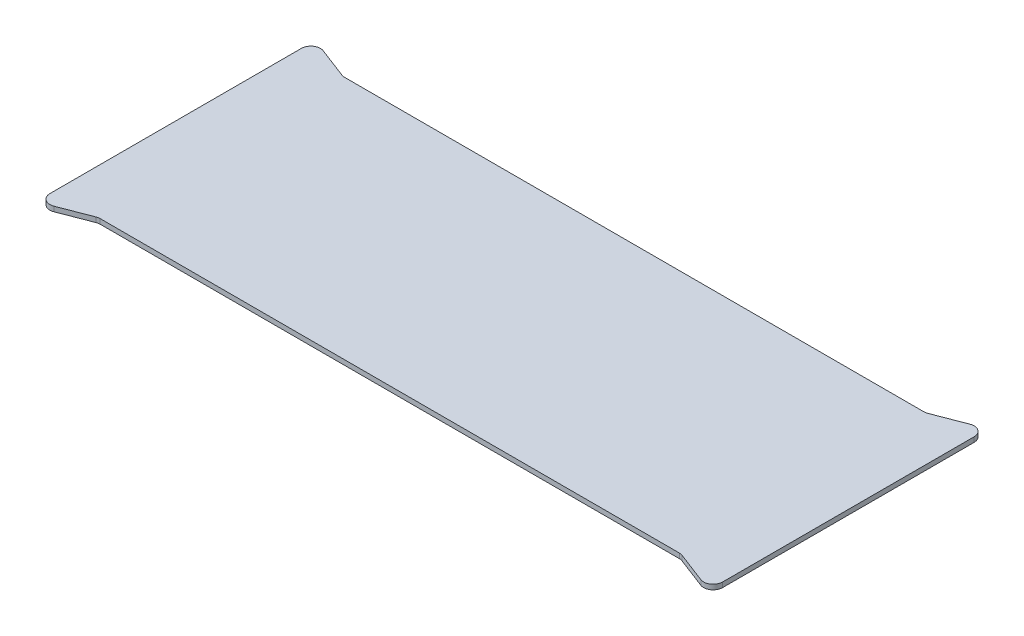
ISO-10303-21;
HEADER;
FILE_DESCRIPTION(('STEP AP214'),'2;1');
FILE_NAME('part.step','',(''),(''),'','','');
FILE_SCHEMA(('AUTOMOTIVE_DESIGN { 1 0 10303 214 1 1 1 1 }'));
ENDSEC;
DATA;
#1=APPLICATION_CONTEXT('core data for automotive mechanical design processes');
#2=APPLICATION_PROTOCOL_DEFINITION('international standard','automotive_design',2000,#1);
#3=PRODUCT_CONTEXT('',#1,'mechanical');
#4=PRODUCT('Part','Part','',(#3));
#5=PRODUCT_RELATED_PRODUCT_CATEGORY('part','',(#4));
#6=PRODUCT_DEFINITION_FORMATION('','',#4);
#7=PRODUCT_DEFINITION_CONTEXT('part definition',#1,'design');
#8=PRODUCT_DEFINITION('design','',#6,#7);
#9=PRODUCT_DEFINITION_SHAPE('','',#8);
#10=(LENGTH_UNIT() NAMED_UNIT(*) SI_UNIT(.MILLI.,.METRE.));
#11=(NAMED_UNIT(*) PLANE_ANGLE_UNIT() SI_UNIT($,.RADIAN.));
#12=(NAMED_UNIT(*) SI_UNIT($,.STERADIAN.) SOLID_ANGLE_UNIT());
#13=UNCERTAINTY_MEASURE_WITH_UNIT(LENGTH_MEASURE(1.E-05),#10,'distance_accuracy_value','');
#14=(GEOMETRIC_REPRESENTATION_CONTEXT(3) GLOBAL_UNCERTAINTY_ASSIGNED_CONTEXT((#13)) GLOBAL_UNIT_ASSIGNED_CONTEXT((#10,
#11,#12)) REPRESENTATION_CONTEXT('',''));
#15=CARTESIAN_POINT('',(0.,0.,0.));
#16=DIRECTION('',(0.,0.,1.));
#17=DIRECTION('',(1.,0.,0.));
#18=AXIS2_PLACEMENT_3D('',#15,#16,#17);
#19=CARTESIAN_POINT('',(55.411978580669,3.175,-144.07114430974));
#20=DIRECTION('',(0.358979079308868,0.,-0.93334560620306));
#21=DIRECTION('',(-0.93334560620306,0.,-0.358979079308868));
#22=AXIS2_PLACEMENT_3D('',#19,#20,#21);
#23=PLANE('',#22);
#24=DIRECTION('',(0.93334560620306,0.,0.358979079308868));
#25=VECTOR('',#24,1.);
#26=CARTESIAN_POINT('',(55.411978580669,3.175,-144.07114430974));
#27=LINE('',#26,#25);
#28=CARTESIAN_POINT('',(-3.55607294556565,3.175,-166.751164127523));
#29=VERTEX_POINT('',#28);
#30=CARTESIAN_POINT('',(16.1464897444059,3.175,-159.173255400611));
#31=VERTEX_POINT('',#30);
#32=EDGE_CURVE('E158',#29,#31,#27,.T.);
#33=ORIENTED_EDGE('',*,*,#32,.T.);
#34=DIRECTION('',(0.,-1.,0.));
#35=VECTOR('',#34,1.);
#36=CARTESIAN_POINT('',(16.1464897444059,0.,-159.173255400611));
#37=LINE('',#36,#35);
#38=CARTESIAN_POINT('',(16.1464897444059,0.,-159.173255400611));
#39=VERTEX_POINT('',#38);
#40=EDGE_CURVE('E255',#31,#39,#37,.T.);
#41=ORIENTED_EDGE('',*,*,#40,.T.);
#42=DIRECTION('',(0.93334560620306,0.,0.358979079308868));
#43=VECTOR('',#42,1.);
#44=CARTESIAN_POINT('',(55.411978580669,0.,-144.07114430974));
#45=LINE('',#44,#43);
#46=CARTESIAN_POINT('',(-3.55607294556565,0.,-166.751164127523));
#47=VERTEX_POINT('',#46);
#48=EDGE_CURVE('E161',#47,#39,#45,.T.);
#49=ORIENTED_EDGE('',*,*,#48,.F.);
#50=DIRECTION('',(0.,-1.,0.));
#51=VECTOR('',#50,1.);
#52=CARTESIAN_POINT('',(-3.55607294556565,3.175,-166.751164127523));
#53=LINE('',#52,#51);
#54=EDGE_CURVE('E152',#29,#47,#53,.T.);
#55=ORIENTED_EDGE('',*,*,#54,.F.);
#56=EDGE_LOOP('',(#33,#41,#49,#55));
#57=FACE_BOUND('',#56,.T.);
#58=ADVANCED_FACE('F41',(#57),#23,.T.);
#59=CARTESIAN_POINT('',(-5.77861853654416,3.175,-160.972545590978));
#60=DIRECTION('',(0.,-1.,0.));
#61=DIRECTION('',(0.,0.,-1.));
#62=AXIS2_PLACEMENT_3D('',#59,#60,#61);
#63=CYLINDRICAL_SURFACE('',#62,6.19129559097851);
#64=CARTESIAN_POINT('',(-5.77861853654416,0.,-160.972545590978));
#65=DIRECTION('',(0.,1.,0.));
#66=DIRECTION('',(0.,0.,1.));
#67=AXIS2_PLACEMENT_3D('',#64,#65,#66);
#68=CIRCLE('',#67,6.19129559097851);
#69=CARTESIAN_POINT('',(-11.9699141275227,0.,-160.972545590978));
#70=VERTEX_POINT('',#69);
#71=EDGE_CURVE('E208',#47,#70,#68,.T.);
#72=ORIENTED_EDGE('',*,*,#71,.T.);
#73=DIRECTION('',(0.,-1.,0.));
#74=VECTOR('',#73,1.);
#75=CARTESIAN_POINT('',(-11.9699141275227,3.175,-160.972545590978));
#76=LINE('',#75,#74);
#77=CARTESIAN_POINT('',(-11.9699141275227,3.175,-160.972545590978));
#78=VERTEX_POINT('',#77);
#79=EDGE_CURVE('E164',#78,#70,#76,.T.);
#80=ORIENTED_EDGE('',*,*,#79,.F.);
#81=CARTESIAN_POINT('',(-5.77861853654416,3.175,-160.972545590978));
#82=DIRECTION('',(0.,1.,0.));
#83=DIRECTION('',(0.,0.,1.));
#84=AXIS2_PLACEMENT_3D('',#81,#82,#83);
#85=CIRCLE('',#84,6.19129559097851);
#86=EDGE_CURVE('E169',#29,#78,#85,.T.);
#87=ORIENTED_EDGE('',*,*,#86,.F.);
#88=ORIENTED_EDGE('',*,*,#54,.T.);
#89=EDGE_LOOP('',(#72,#80,#87,#88));
#90=FACE_BOUND('',#89,.T.);
#91=ADVANCED_FACE('F166',(#90),#63,.T.);
#92=CARTESIAN_POINT('',(-11.9699141275226,3.175,0.));
#93=DIRECTION('',(1.,0.,0.));
#94=DIRECTION('',(0.,0.,-1.));
#95=AXIS2_PLACEMENT_3D('',#92,#93,#94);
#96=PLANE('',#95);
#97=DIRECTION('',(0.,0.,1.));
#98=VECTOR('',#97,1.);
#99=CARTESIAN_POINT('',(-11.9699141275226,0.,0.));
#100=LINE('',#99,#98);
#101=CARTESIAN_POINT('',(-11.9699141275226,0.,2.22254559097851));
#102=VERTEX_POINT('',#101);
#103=EDGE_CURVE('E209',#70,#102,#100,.T.);
#104=ORIENTED_EDGE('',*,*,#103,.T.);
#105=DIRECTION('',(0.,-1.,0.));
#106=VECTOR('',#105,1.);
#107=CARTESIAN_POINT('',(-11.9699141275226,3.175,2.22254559097851));
#108=LINE('',#107,#106);
#109=CARTESIAN_POINT('',(-11.9699141275226,3.175,2.22254559097851));
#110=VERTEX_POINT('',#109);
#111=EDGE_CURVE('E244',#110,#102,#108,.T.);
#112=ORIENTED_EDGE('',*,*,#111,.F.);
#113=DIRECTION('',(0.,0.,1.));
#114=VECTOR('',#113,1.);
#115=CARTESIAN_POINT('',(-11.9699141275226,3.175,0.));
#116=LINE('',#115,#114);
#117=EDGE_CURVE('E175',#78,#110,#116,.T.);
#118=ORIENTED_EDGE('',*,*,#117,.F.);
#119=ORIENTED_EDGE('',*,*,#79,.T.);
#120=EDGE_LOOP('',(#104,#112,#118,#119));
#121=FACE_BOUND('',#120,.T.);
#122=ADVANCED_FACE('F329',(#121),#96,.F.);
#123=CARTESIAN_POINT('',(-5.77861853654416,3.175,2.22254559097852));
#124=DIRECTION('',(0.,-1.,0.));
#125=DIRECTION('',(0.,0.,-1.));
#126=AXIS2_PLACEMENT_3D('',#123,#124,#125);
#127=CYLINDRICAL_SURFACE('',#126,6.19129559097844);
#128=CARTESIAN_POINT('',(-5.77861853654416,0.,2.22254559097852));
#129=DIRECTION('',(0.,1.,0.));
#130=DIRECTION('',(0.,0.,1.));
#131=AXIS2_PLACEMENT_3D('',#128,#129,#130);
#132=CIRCLE('',#131,6.19129559097844);
#133=CARTESIAN_POINT('',(-3.55607294556566,0.,8.00116412752264));
#134=VERTEX_POINT('',#133);
#135=EDGE_CURVE('E215',#102,#134,#132,.T.);
#136=ORIENTED_EDGE('',*,*,#135,.T.);
#137=DIRECTION('',(0.,-1.,0.));
#138=VECTOR('',#137,1.);
#139=CARTESIAN_POINT('',(-3.55607294556566,3.175,8.00116412752264));
#140=LINE('',#139,#138);
#141=CARTESIAN_POINT('',(-3.55607294556566,3.175,8.00116412752264));
#142=VERTEX_POINT('',#141);
#143=EDGE_CURVE('E243',#142,#134,#140,.T.);
#144=ORIENTED_EDGE('',*,*,#143,.F.);
#145=CARTESIAN_POINT('',(-5.77861853654416,3.175,2.22254559097852));
#146=DIRECTION('',(0.,1.,0.));
#147=DIRECTION('',(0.,0.,1.));
#148=AXIS2_PLACEMENT_3D('',#145,#146,#147);
#149=CIRCLE('',#148,6.19129559097844);
#150=EDGE_CURVE('E183',#110,#142,#149,.T.);
#151=ORIENTED_EDGE('',*,*,#150,.F.);
#152=ORIENTED_EDGE('',*,*,#111,.T.);
#153=EDGE_LOOP('',(#136,#144,#151,#152));
#154=FACE_BOUND('',#153,.T.);
#155=ADVANCED_FACE('F333',(#154),#127,.T.);
#156=CARTESIAN_POINT('',(2.22254559097851,3.175,5.77861853654414));
#157=DIRECTION('',(-0.358979079308868,0.,-0.93334560620306));
#158=DIRECTION('',(-0.93334560620306,0.,0.358979079308868));
#159=AXIS2_PLACEMENT_3D('',#156,#157,#158);
#160=PLANE('',#159);
#161=DIRECTION('',(0.93334560620306,0.,-0.358979079308868));
#162=VECTOR('',#161,1.);
#163=CARTESIAN_POINT('',(2.22254559097851,0.,5.77861853654414));
#164=LINE('',#163,#162);
#165=CARTESIAN_POINT('',(16.1464897444059,0.,0.423255400610566));
#166=VERTEX_POINT('',#165);
#167=EDGE_CURVE('E212',#134,#166,#164,.T.);
#168=ORIENTED_EDGE('',*,*,#167,.T.);
#169=DIRECTION('',(0.,-1.,0.));
#170=VECTOR('',#169,1.);
#171=CARTESIAN_POINT('',(16.1464897444059,3.175,0.423255400610567));
#172=LINE('',#171,#170);
#173=CARTESIAN_POINT('',(16.1464897444059,3.175,0.423255400610566));
#174=VERTEX_POINT('',#173);
#175=EDGE_CURVE('E252',#166,#174,#172,.F.);
#176=ORIENTED_EDGE('',*,*,#175,.T.);
#177=DIRECTION('',(0.93334560620306,0.,-0.358979079308868));
#178=VECTOR('',#177,1.);
#179=CARTESIAN_POINT('',(2.22254559097851,3.175,5.77861853654414));
#180=LINE('',#179,#178);
#181=EDGE_CURVE('E190',#142,#174,#180,.T.);
#182=ORIENTED_EDGE('',*,*,#181,.F.);
#183=ORIENTED_EDGE('',*,*,#143,.T.);
#184=EDGE_LOOP('',(#168,#176,#182,#183));
#185=FACE_BOUND('',#184,.T.);
#186=ADVANCED_FACE('F339',(#185),#160,.F.);
#187=CARTESIAN_POINT('',(0.,3.175,0.));
#188=DIRECTION('',(0.,0.,-1.));
#189=DIRECTION('',(-1.,0.,0.));
#190=AXIS2_PLACEMENT_3D('',#187,#188,#189);
#191=PLANE('',#190);
#192=DIRECTION('',(1.,0.,0.));
#193=VECTOR('',#192,1.);
#194=CARTESIAN_POINT('',(0.,3.175,0.));
#195=LINE('',#194,#193);
#196=CARTESIAN_POINT('',(18.4260068980172,3.175,0.));
#197=VERTEX_POINT('',#196);
#198=CARTESIAN_POINT('',(394.323993101984,3.175,0.));
#199=VERTEX_POINT('',#198);
#200=EDGE_CURVE('E187',#197,#199,#195,.T.);
#201=ORIENTED_EDGE('',*,*,#200,.F.);
#202=DIRECTION('',(0.,-1.,0.));
#203=VECTOR('',#202,1.);
#204=CARTESIAN_POINT('',(18.4260068980172,0.,0.));
#205=LINE('',#204,#203);
#206=CARTESIAN_POINT('',(18.4260068980172,0.,0.));
#207=VERTEX_POINT('',#206);
#208=EDGE_CURVE('E246',#197,#207,#205,.T.);
#209=ORIENTED_EDGE('',*,*,#208,.T.);
#210=DIRECTION('',(1.,0.,0.));
#211=VECTOR('',#210,1.);
#212=CARTESIAN_POINT('',(0.,0.,0.));
#213=LINE('',#212,#211);
#214=CARTESIAN_POINT('',(394.323993101984,0.,0.));
#215=VERTEX_POINT('',#214);
#216=EDGE_CURVE('E220',#207,#215,#213,.T.);
#217=ORIENTED_EDGE('',*,*,#216,.T.);
#218=DIRECTION('',(0.,-1.,0.));
#219=VECTOR('',#218,1.);
#220=CARTESIAN_POINT('',(394.323993101984,3.175,0.));
#221=LINE('',#220,#219);
#222=EDGE_CURVE('E163',#215,#199,#221,.F.);
#223=ORIENTED_EDGE('',*,*,#222,.T.);
#224=EDGE_LOOP('',(#201,#209,#217,#223));
#225=FACE_BOUND('',#224,.T.);
#226=ADVANCED_FACE('F285',(#225),#191,.F.);
#227=CARTESIAN_POINT('',(50.966887398712,3.175,-132.513907236652));
#228=DIRECTION('',(-0.358979079308868,0.,0.93334560620306));
#229=DIRECTION('',(0.93334560620306,0.,0.358979079308868));
#230=AXIS2_PLACEMENT_3D('',#227,#228,#229);
#231=PLANE('',#230);
#232=DIRECTION('',(-0.93334560620306,0.,-0.358979079308868));
#233=VECTOR('',#232,1.);
#234=CARTESIAN_POINT('',(50.966887398712,3.175,-132.513907236652));
#235=LINE('',#234,#233);
#236=CARTESIAN_POINT('',(416.306072945567,3.175,8.00116412752288));
#237=VERTEX_POINT('',#236);
#238=CARTESIAN_POINT('',(396.603510255596,3.175,0.423255400610556));
#239=VERTEX_POINT('',#238);
#240=EDGE_CURVE('E194',#237,#239,#235,.T.);
#241=ORIENTED_EDGE('',*,*,#240,.T.);
#242=DIRECTION('',(0.,-1.,0.));
#243=VECTOR('',#242,1.);
#244=CARTESIAN_POINT('',(396.603510255596,3.175,0.423255400610556));
#245=LINE('',#244,#243);
#246=CARTESIAN_POINT('',(396.603510255596,0.,0.423255400610556));
#247=VERTEX_POINT('',#246);
#248=EDGE_CURVE('E263',#239,#247,#245,.T.);
#249=ORIENTED_EDGE('',*,*,#248,.T.);
#250=DIRECTION('',(-0.93334560620306,0.,-0.358979079308868));
#251=VECTOR('',#250,1.);
#252=CARTESIAN_POINT('',(50.966887398712,0.,-132.513907236652));
#253=LINE('',#252,#251);
#254=CARTESIAN_POINT('',(416.306072945567,0.,8.00116412752288));
#255=VERTEX_POINT('',#254);
#256=EDGE_CURVE('E219',#255,#247,#253,.T.);
#257=ORIENTED_EDGE('',*,*,#256,.F.);
#258=DIRECTION('',(0.,-1.,0.));
#259=VECTOR('',#258,1.);
#260=CARTESIAN_POINT('',(416.306072945567,3.175,8.00116412752288));
#261=LINE('',#260,#259);
#262=EDGE_CURVE('E239',#237,#255,#261,.T.);
#263=ORIENTED_EDGE('',*,*,#262,.F.);
#264=EDGE_LOOP('',(#241,#249,#257,#263));
#265=FACE_BOUND('',#264,.T.);
#266=ADVANCED_FACE('F282',(#265),#231,.T.);
#267=CARTESIAN_POINT('',(418.528618536544,3.175,2.22254559097854));
#268=DIRECTION('',(0.,-1.,0.));
#269=DIRECTION('',(0.,0.,-1.));
#270=AXIS2_PLACEMENT_3D('',#267,#268,#269);
#271=CYLINDRICAL_SURFACE('',#270,6.19129559097849);
#272=CARTESIAN_POINT('',(418.528618536544,0.,2.22254559097854));
#273=DIRECTION('',(0.,1.,0.));
#274=DIRECTION('',(0.,0.,1.));
#275=AXIS2_PLACEMENT_3D('',#272,#273,#274);
#276=CIRCLE('',#275,6.19129559097849);
#277=CARTESIAN_POINT('',(424.719914127523,0.,2.22254559097854));
#278=VERTEX_POINT('',#277);
#279=EDGE_CURVE('E224',#255,#278,#276,.T.);
#280=ORIENTED_EDGE('',*,*,#279,.T.);
#281=DIRECTION('',(0.,-1.,0.));
#282=VECTOR('',#281,1.);
#283=CARTESIAN_POINT('',(424.719914127523,3.175,2.22254559097854));
#284=LINE('',#283,#282);
#285=CARTESIAN_POINT('',(424.719914127523,3.175,2.22254559097854));
#286=VERTEX_POINT('',#285);
#287=EDGE_CURVE('E237',#286,#278,#284,.T.);
#288=ORIENTED_EDGE('',*,*,#287,.F.);
#289=CARTESIAN_POINT('',(418.528618536544,3.175,2.22254559097854));
#290=DIRECTION('',(0.,1.,0.));
#291=DIRECTION('',(0.,0.,1.));
#292=AXIS2_PLACEMENT_3D('',#289,#290,#291);
#293=CIRCLE('',#292,6.19129559097849);
#294=EDGE_CURVE('E191',#237,#286,#293,.T.);
#295=ORIENTED_EDGE('',*,*,#294,.F.);
#296=ORIENTED_EDGE('',*,*,#262,.T.);
#297=EDGE_LOOP('',(#280,#288,#295,#296));
#298=FACE_BOUND('',#297,.T.);
#299=ADVANCED_FACE('F292',(#298),#271,.T.);
#300=CARTESIAN_POINT('',(424.719914127523,3.175,2.88938732327096E-13));
#301=DIRECTION('',(-1.,0.,0.));
#302=DIRECTION('',(0.,0.,1.));
#303=AXIS2_PLACEMENT_3D('',#300,#301,#302);
#304=PLANE('',#303);
#305=DIRECTION('',(0.,0.,-1.));
#306=VECTOR('',#305,1.);
#307=CARTESIAN_POINT('',(424.719914127523,0.,2.88938732327096E-13));
#308=LINE('',#307,#306);
#309=CARTESIAN_POINT('',(424.719914127523,0.,-160.972545590978));
#310=VERTEX_POINT('',#309);
#311=EDGE_CURVE('E223',#278,#310,#308,.T.);
#312=ORIENTED_EDGE('',*,*,#311,.T.);
#313=DIRECTION('',(0.,-1.,0.));
#314=VECTOR('',#313,1.);
#315=CARTESIAN_POINT('',(424.719914127523,3.175,-160.972545590978));
#316=LINE('',#315,#314);
#317=CARTESIAN_POINT('',(424.719914127523,3.175,-160.972545590978));
#318=VERTEX_POINT('',#317);
#319=EDGE_CURVE('E235',#318,#310,#316,.T.);
#320=ORIENTED_EDGE('',*,*,#319,.F.);
#321=DIRECTION('',(0.,0.,-1.));
#322=VECTOR('',#321,1.);
#323=CARTESIAN_POINT('',(424.719914127523,3.175,2.88938732327096E-13));
#324=LINE('',#323,#322);
#325=EDGE_CURVE('E198',#286,#318,#324,.T.);
#326=ORIENTED_EDGE('',*,*,#325,.F.);
#327=ORIENTED_EDGE('',*,*,#287,.T.);
#328=EDGE_LOOP('',(#312,#320,#326,#327));
#329=FACE_BOUND('',#328,.T.);
#330=ADVANCED_FACE('F294',(#329),#304,.F.);
#331=CARTESIAN_POINT('',(418.528618536546,3.175,-160.972545590978));
#332=DIRECTION('',(0.,-1.,0.));
#333=DIRECTION('',(0.,0.,-1.));
#334=AXIS2_PLACEMENT_3D('',#331,#332,#333);
#335=CYLINDRICAL_SURFACE('',#334,6.19129559097724);
#336=CARTESIAN_POINT('',(418.528618536546,0.,-160.972545590978));
#337=DIRECTION('',(0.,1.,0.));
#338=DIRECTION('',(0.,0.,1.));
#339=AXIS2_PLACEMENT_3D('',#336,#337,#338);
#340=CIRCLE('',#339,6.19129559097724);
#341=CARTESIAN_POINT('',(416.306072945567,0.,-166.751164127522));
#342=VERTEX_POINT('',#341);
#343=EDGE_CURVE('E230',#310,#342,#340,.T.);
#344=ORIENTED_EDGE('',*,*,#343,.T.);
#345=DIRECTION('',(0.,-1.,0.));
#346=VECTOR('',#345,1.);
#347=CARTESIAN_POINT('',(416.306072945567,3.175,-166.751164127522));
#348=LINE('',#347,#346);
#349=CARTESIAN_POINT('',(416.306072945567,3.175,-166.751164127522));
#350=VERTEX_POINT('',#349);
#351=EDGE_CURVE('E206',#350,#342,#348,.T.);
#352=ORIENTED_EDGE('',*,*,#351,.F.);
#353=CARTESIAN_POINT('',(418.528618536546,3.175,-160.972545590978));
#354=DIRECTION('',(0.,1.,0.));
#355=DIRECTION('',(0.,0.,1.));
#356=AXIS2_PLACEMENT_3D('',#353,#354,#355);
#357=CIRCLE('',#356,6.19129559097724);
#358=EDGE_CURVE('E196',#318,#350,#357,.T.);
#359=ORIENTED_EDGE('',*,*,#358,.F.);
#360=ORIENTED_EDGE('',*,*,#319,.T.);
#361=EDGE_LOOP('',(#344,#352,#359,#360));
#362=FACE_BOUND('',#361,.T.);
#363=ADVANCED_FACE('F299',(#362),#335,.T.);
#364=CARTESIAN_POINT('',(-2.22254559097834,3.175,-5.77861853654369));
#365=DIRECTION('',(0.358979079308869,0.,0.93334560620306));
#366=DIRECTION('',(0.93334560620306,0.,-0.358979079308869));
#367=AXIS2_PLACEMENT_3D('',#364,#365,#366);
#368=PLANE('',#367);
#369=DIRECTION('',(-0.93334560620306,0.,0.358979079308869));
#370=VECTOR('',#369,1.);
#371=CARTESIAN_POINT('',(-2.22254559097834,0.,-5.77861853654369));
#372=LINE('',#371,#370);
#373=CARTESIAN_POINT('',(396.603510255596,0.,-159.173255400611));
#374=VERTEX_POINT('',#373);
#375=EDGE_CURVE('E182',#342,#374,#372,.T.);
#376=ORIENTED_EDGE('',*,*,#375,.T.);
#377=DIRECTION('',(0.,-1.,0.));
#378=VECTOR('',#377,1.);
#379=CARTESIAN_POINT('',(396.603510255596,3.175,-159.173255400611));
#380=LINE('',#379,#378);
#381=CARTESIAN_POINT('',(396.603510255596,3.175,-159.173255400611));
#382=VERTEX_POINT('',#381);
#383=EDGE_CURVE('E261',#374,#382,#380,.F.);
#384=ORIENTED_EDGE('',*,*,#383,.T.);
#385=DIRECTION('',(-0.93334560620306,0.,0.358979079308869));
#386=VECTOR('',#385,1.);
#387=CARTESIAN_POINT('',(-2.22254559097834,3.175,-5.77861853654369));
#388=LINE('',#387,#386);
#389=EDGE_CURVE('E199',#350,#382,#388,.T.);
#390=ORIENTED_EDGE('',*,*,#389,.F.);
#391=ORIENTED_EDGE('',*,*,#351,.T.);
#392=EDGE_LOOP('',(#376,#384,#390,#391));
#393=FACE_BOUND('',#392,.T.);
#394=ADVANCED_FACE('F355',(#393),#368,.F.);
#395=CARTESIAN_POINT('',(0.,3.175,-158.75));
#396=DIRECTION('',(0.,0.,-1.));
#397=DIRECTION('',(-1.,0.,0.));
#398=AXIS2_PLACEMENT_3D('',#395,#396,#397);
#399=PLANE('',#398);
#400=DIRECTION('',(1.,0.,0.));
#401=VECTOR('',#400,1.);
#402=CARTESIAN_POINT('',(0.,0.,-158.75));
#403=LINE('',#402,#401);
#404=CARTESIAN_POINT('',(18.4260068980172,0.,-158.75));
#405=VERTEX_POINT('',#404);
#406=CARTESIAN_POINT('',(394.323993101984,0.,-158.75));
#407=VERTEX_POINT('',#406);
#408=EDGE_CURVE('E180',#405,#407,#403,.T.);
#409=ORIENTED_EDGE('',*,*,#408,.F.);
#410=DIRECTION('',(0.,-1.,0.));
#411=VECTOR('',#410,1.);
#412=CARTESIAN_POINT('',(18.4260068980172,3.175,-158.75));
#413=LINE('',#412,#411);
#414=CARTESIAN_POINT('',(18.4260068980172,3.175,-158.75));
#415=VERTEX_POINT('',#414);
#416=EDGE_CURVE('E259',#405,#415,#413,.F.);
#417=ORIENTED_EDGE('',*,*,#416,.T.);
#418=DIRECTION('',(1.,0.,0.));
#419=VECTOR('',#418,1.);
#420=CARTESIAN_POINT('',(0.,3.175,-158.75));
#421=LINE('',#420,#419);
#422=CARTESIAN_POINT('',(394.323993101984,3.175,-158.75));
#423=VERTEX_POINT('',#422);
#424=EDGE_CURVE('E201',#415,#423,#421,.T.);
#425=ORIENTED_EDGE('',*,*,#424,.T.);
#426=DIRECTION('',(0.,-1.,0.));
#427=VECTOR('',#426,1.);
#428=CARTESIAN_POINT('',(394.323993101984,3.175,-158.75));
#429=LINE('',#428,#427);
#430=EDGE_CURVE('E258',#423,#407,#429,.T.);
#431=ORIENTED_EDGE('',*,*,#430,.T.);
#432=EDGE_LOOP('',(#409,#417,#425,#431));
#433=FACE_BOUND('',#432,.T.);
#434=ADVANCED_FACE('F310',(#433),#399,.T.);
#435=CARTESIAN_POINT('',(0.,3.175,0.));
#436=DIRECTION('',(0.,1.,0.));
#437=DIRECTION('',(0.,0.,1.));
#438=AXIS2_PLACEMENT_3D('',#435,#436,#437);
#439=PLANE('',#438);
#440=ORIENTED_EDGE('',*,*,#32,.F.);
#441=ORIENTED_EDGE('',*,*,#86,.T.);
#442=ORIENTED_EDGE('',*,*,#117,.T.);
#443=ORIENTED_EDGE('',*,*,#150,.T.);
#444=ORIENTED_EDGE('',*,*,#181,.T.);
#445=CARTESIAN_POINT('',(18.4260068980172,3.175,6.35));
#446=DIRECTION('',(0.,1.,0.));
#447=DIRECTION('',(0.,0.,1.));
#448=AXIS2_PLACEMENT_3D('',#445,#446,#447);
#449=CIRCLE('',#448,6.35);
#450=EDGE_CURVE('E270',#174,#197,#449,.F.);
#451=ORIENTED_EDGE('',*,*,#450,.T.);
#452=ORIENTED_EDGE('',*,*,#200,.T.);
#453=CARTESIAN_POINT('',(394.323993101984,3.175,6.34999999999999));
#454=DIRECTION('',(0.,1.,0.));
#455=DIRECTION('',(0.,0.,1.));
#456=AXIS2_PLACEMENT_3D('',#453,#454,#455);
#457=CIRCLE('',#456,6.35);
#458=EDGE_CURVE('E11',#199,#239,#457,.F.);
#459=ORIENTED_EDGE('',*,*,#458,.T.);
#460=ORIENTED_EDGE('',*,*,#240,.F.);
#461=ORIENTED_EDGE('',*,*,#294,.T.);
#462=ORIENTED_EDGE('',*,*,#325,.T.);
#463=ORIENTED_EDGE('',*,*,#358,.T.);
#464=ORIENTED_EDGE('',*,*,#389,.T.);
#465=CARTESIAN_POINT('',(394.323993101984,3.175,-165.1));
#466=DIRECTION('',(0.,1.,0.));
#467=DIRECTION('',(0.,0.,1.));
#468=AXIS2_PLACEMENT_3D('',#465,#466,#467);
#469=CIRCLE('',#468,6.35);
#470=EDGE_CURVE('E273',#382,#423,#469,.F.);
#471=ORIENTED_EDGE('',*,*,#470,.T.);
#472=ORIENTED_EDGE('',*,*,#424,.F.);
#473=CARTESIAN_POINT('',(18.4260068980172,3.175,-165.1));
#474=DIRECTION('',(0.,1.,0.));
#475=DIRECTION('',(0.,0.,1.));
#476=AXIS2_PLACEMENT_3D('',#473,#474,#475);
#477=CIRCLE('',#476,6.35);
#478=EDGE_CURVE('E179',#415,#31,#477,.F.);
#479=ORIENTED_EDGE('',*,*,#478,.T.);
#480=EDGE_LOOP('',(#440,#441,#442,#443,#444,#451,#452,#459,#460,#461,#462,#463,#464,#471,#472,#479));
#481=FACE_BOUND('',#480,.T.);
#482=ADVANCED_FACE('F174',(#481),#439,.T.);
#483=CARTESIAN_POINT('',(0.,0.,0.));
#484=DIRECTION('',(0.,1.,0.));
#485=DIRECTION('',(0.,0.,1.));
#486=AXIS2_PLACEMENT_3D('',#483,#484,#485);
#487=PLANE('',#486);
#488=ORIENTED_EDGE('',*,*,#48,.T.);
#489=CARTESIAN_POINT('',(18.4260068980172,0.,-165.1));
#490=DIRECTION('',(0.,1.,0.));
#491=DIRECTION('',(0.,0.,1.));
#492=AXIS2_PLACEMENT_3D('',#489,#490,#491);
#493=CIRCLE('',#492,6.35);
#494=EDGE_CURVE('E267',#39,#405,#493,.T.);
#495=ORIENTED_EDGE('',*,*,#494,.T.);
#496=ORIENTED_EDGE('',*,*,#408,.T.);
#497=CARTESIAN_POINT('',(394.323993101984,0.,-165.1));
#498=DIRECTION('',(0.,1.,0.));
#499=DIRECTION('',(0.,0.,1.));
#500=AXIS2_PLACEMENT_3D('',#497,#498,#499);
#501=CIRCLE('',#500,6.35);
#502=EDGE_CURVE('E275',#407,#374,#501,.T.);
#503=ORIENTED_EDGE('',*,*,#502,.T.);
#504=ORIENTED_EDGE('',*,*,#375,.F.);
#505=ORIENTED_EDGE('',*,*,#343,.F.);
#506=ORIENTED_EDGE('',*,*,#311,.F.);
#507=ORIENTED_EDGE('',*,*,#279,.F.);
#508=ORIENTED_EDGE('',*,*,#256,.T.);
#509=CARTESIAN_POINT('',(394.323993101984,0.,6.34999999999999));
#510=DIRECTION('',(0.,1.,0.));
#511=DIRECTION('',(0.,0.,1.));
#512=AXIS2_PLACEMENT_3D('',#509,#510,#511);
#513=CIRCLE('',#512,6.35);
#514=EDGE_CURVE('E47',#247,#215,#513,.T.);
#515=ORIENTED_EDGE('',*,*,#514,.T.);
#516=ORIENTED_EDGE('',*,*,#216,.F.);
#517=CARTESIAN_POINT('',(18.4260068980172,0.,6.35));
#518=DIRECTION('',(0.,1.,0.));
#519=DIRECTION('',(0.,0.,1.));
#520=AXIS2_PLACEMENT_3D('',#517,#518,#519);
#521=CIRCLE('',#520,6.35);
#522=EDGE_CURVE('E264',#207,#166,#521,.T.);
#523=ORIENTED_EDGE('',*,*,#522,.T.);
#524=ORIENTED_EDGE('',*,*,#167,.F.);
#525=ORIENTED_EDGE('',*,*,#135,.F.);
#526=ORIENTED_EDGE('',*,*,#103,.F.);
#527=ORIENTED_EDGE('',*,*,#71,.F.);
#528=EDGE_LOOP('',(#488,#495,#496,#503,#504,#505,#506,#507,#508,#515,#516,#523,#524,#525,#526,#527));
#529=FACE_BOUND('',#528,.T.);
#530=ADVANCED_FACE('F280',(#529),#487,.F.);
#531=CARTESIAN_POINT('',(18.4260068980172,3.175,6.35));
#532=DIRECTION('',(0.,1.,0.));
#533=DIRECTION('',(0.,0.,1.));
#534=AXIS2_PLACEMENT_3D('',#531,#532,#533);
#535=CYLINDRICAL_SURFACE('',#534,6.35);
#536=ORIENTED_EDGE('',*,*,#450,.F.);
#537=ORIENTED_EDGE('',*,*,#175,.F.);
#538=ORIENTED_EDGE('',*,*,#522,.F.);
#539=ORIENTED_EDGE('',*,*,#208,.F.);
#540=EDGE_LOOP('',(#536,#537,#538,#539));
#541=FACE_BOUND('',#540,.T.);
#542=ADVANCED_FACE('F312',(#541),#535,.F.);
#543=CARTESIAN_POINT('',(18.4260068980172,3.175,-165.1));
#544=DIRECTION('',(0.,1.,0.));
#545=DIRECTION('',(0.,0.,1.));
#546=AXIS2_PLACEMENT_3D('',#543,#544,#545);
#547=CYLINDRICAL_SURFACE('',#546,6.35);
#548=ORIENTED_EDGE('',*,*,#478,.F.);
#549=ORIENTED_EDGE('',*,*,#416,.F.);
#550=ORIENTED_EDGE('',*,*,#494,.F.);
#551=ORIENTED_EDGE('',*,*,#40,.F.);
#552=EDGE_LOOP('',(#548,#549,#550,#551));
#553=FACE_BOUND('',#552,.T.);
#554=ADVANCED_FACE('F311',(#553),#547,.F.);
#555=CARTESIAN_POINT('',(394.323993101984,3.175,-165.1));
#556=DIRECTION('',(0.,-1.,0.));
#557=DIRECTION('',(0.,0.,-1.));
#558=AXIS2_PLACEMENT_3D('',#555,#556,#557);
#559=CYLINDRICAL_SURFACE('',#558,6.35);
#560=ORIENTED_EDGE('',*,*,#470,.F.);
#561=ORIENTED_EDGE('',*,*,#383,.F.);
#562=ORIENTED_EDGE('',*,*,#502,.F.);
#563=ORIENTED_EDGE('',*,*,#430,.F.);
#564=EDGE_LOOP('',(#560,#561,#562,#563));
#565=FACE_BOUND('',#564,.T.);
#566=ADVANCED_FACE('F308',(#565),#559,.F.);
#567=CARTESIAN_POINT('',(394.323993101984,3.175,6.34999999999999));
#568=DIRECTION('',(0.,-1.,0.));
#569=DIRECTION('',(0.,0.,-1.));
#570=AXIS2_PLACEMENT_3D('',#567,#568,#569);
#571=CYLINDRICAL_SURFACE('',#570,6.35);
#572=ORIENTED_EDGE('',*,*,#458,.F.);
#573=ORIENTED_EDGE('',*,*,#222,.F.);
#574=ORIENTED_EDGE('',*,*,#514,.F.);
#575=ORIENTED_EDGE('',*,*,#248,.F.);
#576=EDGE_LOOP('',(#572,#573,#574,#575));
#577=FACE_BOUND('',#576,.T.);
#578=ADVANCED_FACE('F43',(#577),#571,.F.);
#579=CLOSED_SHELL('',(#58,#91,#122,#155,#186,#226,#266,#299,#330,#363,#394,#434,#482,#530,#542,
#554,#566,#578));
#580=MANIFOLD_SOLID_BREP('B2',#579);
#581=ADVANCED_BREP_SHAPE_REPRESENTATION('',(#18,#580),#14);
#582=SHAPE_DEFINITION_REPRESENTATION(#9,#581);
ENDSEC;
END-ISO-10303-21;
